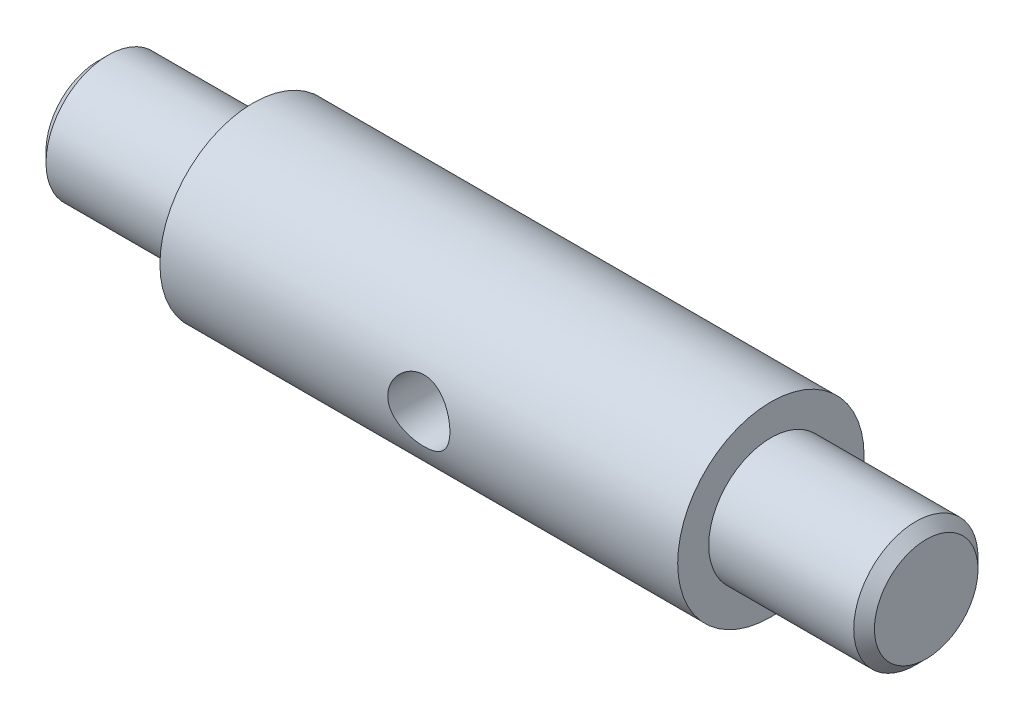
ISO-10303-21;
HEADER;
FILE_DESCRIPTION(('STEP AP214'),'2;1');
FILE_NAME('part.step','',(''),(''),'','','');
FILE_SCHEMA(('AUTOMOTIVE_DESIGN { 1 0 10303 214 1 1 1 1 }'));
ENDSEC;
DATA;
#1=APPLICATION_CONTEXT('core data for automotive mechanical design processes');
#2=APPLICATION_PROTOCOL_DEFINITION('international standard','automotive_design',2000,#1);
#3=PRODUCT_CONTEXT('',#1,'mechanical');
#4=PRODUCT('Part','Part','',(#3));
#5=PRODUCT_RELATED_PRODUCT_CATEGORY('part','',(#4));
#6=PRODUCT_DEFINITION_FORMATION('','',#4);
#7=PRODUCT_DEFINITION_CONTEXT('part definition',#1,'design');
#8=PRODUCT_DEFINITION('design','',#6,#7);
#9=PRODUCT_DEFINITION_SHAPE('','',#8);
#10=(LENGTH_UNIT() NAMED_UNIT(*) SI_UNIT(.MILLI.,.METRE.));
#11=(NAMED_UNIT(*) PLANE_ANGLE_UNIT() SI_UNIT($,.RADIAN.));
#12=(NAMED_UNIT(*) SI_UNIT($,.STERADIAN.) SOLID_ANGLE_UNIT());
#13=UNCERTAINTY_MEASURE_WITH_UNIT(LENGTH_MEASURE(1.E-05),#10,'distance_accuracy_value','');
#14=(GEOMETRIC_REPRESENTATION_CONTEXT(3) GLOBAL_UNCERTAINTY_ASSIGNED_CONTEXT((#13)) GLOBAL_UNIT_ASSIGNED_CONTEXT((#10,
#11,#12)) REPRESENTATION_CONTEXT('',''));
#15=CARTESIAN_POINT('',(0.,0.,0.));
#16=DIRECTION('',(0.,0.,1.));
#17=DIRECTION('',(1.,0.,0.));
#18=AXIS2_PLACEMENT_3D('',#15,#16,#17);
#19=CARTESIAN_POINT('',(8.00000000000001,0.,-9.));
#20=DIRECTION('',(0.,0.,1.));
#21=DIRECTION('',(1.,0.,0.));
#22=AXIS2_PLACEMENT_3D('',#19,#20,#21);
#23=CYLINDRICAL_SURFACE('',#22,3.);
#24=CARTESIAN_POINT('',(11.,0.,9.));
#25=CARTESIAN_POINT('',(11.0000007611949,-0.163690088660169,9.00000045902832));
#26=CARTESIAN_POINT('',(10.9865592016184,-0.327375583615649,8.99549308522634));
#27=CARTESIAN_POINT('',(10.9333126735484,-0.649925282618916,8.97795630609841));
#28=CARTESIAN_POINT('',(10.8935049681532,-0.808788984356453,8.96492601606457));
#29=CARTESIAN_POINT('',(10.7890422698479,-1.11699836850533,8.93175923719327));
#30=CARTESIAN_POINT('',(10.7244288126222,-1.2663594776581,8.91163463192559));
#31=CARTESIAN_POINT('',(10.572376481485,-1.55212481041597,8.86633337152025));
#32=CARTESIAN_POINT('',(10.4849331049922,-1.68852647087612,8.84115572003333));
#33=CARTESIAN_POINT('',(10.2865225854237,-1.9492250250668,8.78742283329015));
#34=CARTESIAN_POINT('',(10.1749062972185,-2.07301110089493,8.75878669391354));
#35=CARTESIAN_POINT('',(9.93269853588031,-2.30049807810625,8.70180944349364));
#36=CARTESIAN_POINT('',(9.80210289521447,-2.40419455646839,8.67346839871647));
#37=CARTESIAN_POINT('',(9.52104465441063,-2.59147482668358,8.61939997431821));
#38=CARTESIAN_POINT('',(9.37011878080364,-2.67439457466309,8.59377117827064));
#39=CARTESIAN_POINT('',(9.05547171662437,-2.81345662163316,8.54925916255803));
#40=CARTESIAN_POINT('',(8.89175444851177,-2.86960709216029,8.53037388482236));
#41=CARTESIAN_POINT('',(8.56198033550988,-2.95162038452749,8.50233909808131));
#42=CARTESIAN_POINT('',(8.39618837453281,-2.97844034481531,8.49288287308833));
#43=CARTESIAN_POINT('',(8.06220873753237,-3.00402337000343,8.48386969888522));
#44=CARTESIAN_POINT('',(7.89402181787244,-3.00279510481415,8.48430969068189));
#45=CARTESIAN_POINT('',(7.56819010866794,-2.97305971111026,8.4947704502454));
#46=CARTESIAN_POINT('',(7.41041479124295,-2.94580173950098,8.50435247602598));
#47=CARTESIAN_POINT('',(7.1018197411795,-2.86681848854825,8.53129973173652));
#48=CARTESIAN_POINT('',(6.9510008436948,-2.81509027977561,8.54866589352322));
#49=CARTESIAN_POINT('',(6.65776175122557,-2.68781717418063,8.58953733393746));
#50=CARTESIAN_POINT('',(6.51551592359143,-2.61190214612179,8.61313697379351));
#51=CARTESIAN_POINT('',(6.24538727516083,-2.43866731890942,8.66377675727179));
#52=CARTESIAN_POINT('',(6.11750861919986,-2.34134133709202,8.6908178937139));
#53=CARTESIAN_POINT('',(5.87272520551769,-2.12204799804671,8.74701987503222));
#54=CARTESIAN_POINT('',(5.7567419164728,-1.99905945022893,8.77621768064528));
#55=CARTESIAN_POINT('',(5.54680620000982,-1.73501870991019,8.83220815161109));
#56=CARTESIAN_POINT('',(5.45285588550652,-1.59396478698244,8.85900058614201));
#57=CARTESIAN_POINT('',(5.2889110992948,-1.2958428391388,8.9075132381338));
#58=CARTESIAN_POINT('',(5.21916352597781,-1.13862982924901,8.92918050024117));
#59=CARTESIAN_POINT('',(5.10739047813288,-0.813807250093522,8.96461701433304));
#60=CARTESIAN_POINT('',(5.0653553737297,-0.646201314464861,8.97838900964637));
#61=CARTESIAN_POINT('',(5.01183300193293,-0.313151488587912,8.99602881214321));
#62=CARTESIAN_POINT('',(4.99910057248175,-0.14792879959454,9.00030005501183));
#63=CARTESIAN_POINT('',(5.00099802079541,0.182325209880711,8.99966708084482));
#64=CARTESIAN_POINT('',(5.01562327993964,0.347356557958951,8.99476441258086));
#65=CARTESIAN_POINT('',(5.07083572320789,0.667559598912766,8.97660074151312));
#66=CARTESIAN_POINT('',(5.11065861814849,0.822878420504529,8.96358596133576));
#67=CARTESIAN_POINT('',(5.21418033340019,1.12456787573872,8.93075540490209));
#68=CARTESIAN_POINT('',(5.27788219840336,1.27093736552582,8.91093876140025));
#69=CARTESIAN_POINT('',(5.42921129552237,1.55486488917982,8.86586793861869));
#70=CARTESIAN_POINT('',(5.51742377984952,1.69208987765144,8.84048444267358));
#71=CARTESIAN_POINT('',(5.71458245004046,1.95019449040676,8.78715761748787));
#72=CARTESIAN_POINT('',(5.8235349680953,2.07106910338673,8.75921350781482));
#73=CARTESIAN_POINT('',(6.06493625301977,2.2987575234189,8.70230543941334));
#74=CARTESIAN_POINT('',(6.19822768078059,2.40468290773731,8.67335283262283));
#75=CARTESIAN_POINT('',(6.48131470343267,2.59277256697072,8.61899919884126));
#76=CARTESIAN_POINT('',(6.63111043590224,2.67493664379304,8.59359820146006));
#77=CARTESIAN_POINT('',(6.94301904586969,2.81279079124908,8.5494717537415));
#78=CARTESIAN_POINT('',(7.1051062375063,2.86853439649506,8.53073282378936));
#79=CARTESIAN_POINT('',(7.4371359501324,2.95168400027807,8.50232496919348));
#80=CARTESIAN_POINT('',(7.60707489621306,2.97910276486182,8.49265195870917));
#81=CARTESIAN_POINT('',(7.94059128812276,3.00382884743203,8.48393576622531));
#82=CARTESIAN_POINT('',(8.10404702086048,3.0026107719252,8.48437200772245));
#83=CARTESIAN_POINT('',(8.4282952247662,2.97372688034608,8.49453809471601));
#84=CARTESIAN_POINT('',(8.58908785386527,2.94606263837576,8.50426738708084));
#85=CARTESIAN_POINT('',(8.90040698900742,2.86611543938804,8.53153572914674));
#86=CARTESIAN_POINT('',(9.05107047501349,2.81431003804654,8.54892294067432));
#87=CARTESIAN_POINT('',(9.34168222081481,2.68793809727924,8.58949196455405));
#88=CARTESIAN_POINT('',(9.48162809356402,2.61336650566142,8.61267506290179));
#89=CARTESIAN_POINT('',(9.75345100976874,2.43978207775029,8.66348487678138));
#90=CARTESIAN_POINT('',(9.88470950569516,2.33984472829374,8.69126134926411));
#91=CARTESIAN_POINT('',(10.1290694401526,2.11992864940695,8.74750068849758));
#92=CARTESIAN_POINT('',(10.2421657270642,1.99994425335445,8.77596374737116));
#93=CARTESIAN_POINT('',(10.4514332368675,1.73772467076206,8.83170091576632));
#94=CARTESIAN_POINT('',(10.546773043253,1.59480454049919,8.85888545403769));
#95=CARTESIAN_POINT('',(10.7119712865519,1.29407207221987,8.90777973517836));
#96=CARTESIAN_POINT('',(10.7818362377661,1.13626355439705,8.92949087723789));
#97=CARTESIAN_POINT('',(10.891164897466,0.817480941602927,8.96416545205625));
#98=CARTESIAN_POINT('',(10.9318473987901,0.656963273029225,8.97747637267567));
#99=CARTESIAN_POINT('',(10.9862608420314,0.33096124803074,8.99539221192665));
#100=CARTESIAN_POINT('',(10.9999992304896,0.165478276706238,8.99999953595715));
#101=CARTESIAN_POINT('',(11.,0.,9.));
#102=B_SPLINE_CURVE_WITH_KNOTS('',3,(#24,#25,#26,#27,#28,#29,#30,#31,#32,#33,#34,#35,#36,#37,
#38,#39,#40,#41,#42,#43,#44,#45,#46,#47,#48,#49,#50,#51,#52,#53,#54,#55,#56,#57,#58,#59,#60,#61,
#62,#63,#64,#65,#66,#67,#68,#69,#70,#71,#72,#73,#74,#75,#76,#77,#78,#79,#80,#81,#82,#83,#84,#85,
#86,#87,#88,#89,#90,#91,#92,#93,#94,#95,#96,#97,#98,#99,#100,#101),.UNSPECIFIED.,.T.,.F.,(4,2,2,
2,2,2,2,2,2,2,2,2,2,2,2,2,2,2,2,2,2,2,2,2,2,2,2,2,2,2,2,2,2,2,2,2,2,2,4),(0.,0.490461318078032,
0.980973555802562,1.47066801861082,1.9604591333973,2.46554052848268,2.97073299862591,
3.49045154470411,4.010011340785,4.5120577722552,5.01394901962456,5.49290479653841,
5.97191792566446,6.45864513465392,6.94551307674621,7.45779917434101,7.97013437899854,
8.48755216951072,9.00479006631624,9.49960749525508,9.99434139492529,10.4747447393464,
10.9552093585231,11.4483119953121,11.9415654246567,12.4572306864226,12.9729002470499,
13.4875204148031,14.0019085411752,14.4898699819277,14.9778023805413,15.4564676124125,
15.9352391452793,16.4349020007541,16.9347063337134,17.453989825053,17.9731404345737,
18.4690967512144,18.9649159811442),.UNSPECIFIED.);
#103=CARTESIAN_POINT('',(11.,0.,9.));
#104=VERTEX_POINT('',#103);
#105=EDGE_CURVE('E87',#104,#104,#102,.T.);
#106=ORIENTED_EDGE('',*,*,#105,.F.);
#107=EDGE_LOOP('',(#106));
#108=FACE_BOUND('',#107,.T.);
#109=CARTESIAN_POINT('',(8.00000000000001,0.,0.));
#110=DIRECTION('',(0.707106781186547,0.,0.707106781186547));
#111=DIRECTION('',(-0.707106781186547,0.,0.707106781186547));
#112=AXIS2_PLACEMENT_3D('',#109,#110,#111);
#113=ELLIPSE('',#112,4.24264068711928,3.);
#114=CARTESIAN_POINT('',(8.00000000000001,-3.,0.));
#115=VERTEX_POINT('',#114);
#116=CARTESIAN_POINT('',(8.00000000000001,3.,0.));
#117=VERTEX_POINT('',#116);
#118=EDGE_CURVE('E50',#115,#117,#113,.F.);
#119=ORIENTED_EDGE('',*,*,#118,.T.);
#120=CARTESIAN_POINT('',(8.00000000000001,0.,0.));
#121=DIRECTION('',(-0.707106781186547,0.,0.707106781186547));
#122=DIRECTION('',(0.707106781186547,0.,0.707106781186547));
#123=AXIS2_PLACEMENT_3D('',#120,#121,#122);
#124=ELLIPSE('',#123,4.24264068711928,3.);
#125=EDGE_CURVE('E11',#117,#115,#124,.F.);
#126=ORIENTED_EDGE('',*,*,#125,.T.);
#127=EDGE_LOOP('',(#119,#126));
#128=FACE_BOUND('',#127,.T.);
#129=ADVANCED_FACE('F36',(#108,#128),#23,.F.);
#130=CARTESIAN_POINT('',(-32.,6.,0.));
#131=DIRECTION('',(1.,0.,0.));
#132=DIRECTION('',(0.,0.,-1.));
#133=AXIS2_PLACEMENT_3D('',#130,#131,#132);
#134=PLANE('',#133);
#135=CARTESIAN_POINT('',(-32.,0.,0.));
#136=DIRECTION('',(-1.,0.,0.));
#137=DIRECTION('',(0.,0.,1.));
#138=AXIS2_PLACEMENT_3D('',#135,#136,#137);
#139=CIRCLE('',#138,2.99999999999999);
#140=CARTESIAN_POINT('',(-32.,0.,2.99999999999999));
#141=VERTEX_POINT('',#140);
#142=EDGE_CURVE('E71',#141,#141,#139,.T.);
#143=ORIENTED_EDGE('',*,*,#142,.F.);
#144=EDGE_LOOP('',(#143));
#145=FACE_BOUND('',#144,.T.);
#146=CARTESIAN_POINT('',(-32.,0.,0.));
#147=DIRECTION('',(1.,0.,0.));
#148=DIRECTION('',(0.,0.,-1.));
#149=AXIS2_PLACEMENT_3D('',#146,#147,#148);
#150=CIRCLE('',#149,5.);
#151=CARTESIAN_POINT('',(-32.,0.,-5.));
#152=VERTEX_POINT('',#151);
#153=EDGE_CURVE('E171',#152,#152,#150,.F.);
#154=ORIENTED_EDGE('',*,*,#153,.T.);
#155=EDGE_LOOP('',(#154));
#156=FACE_BOUND('',#155,.T.);
#157=ADVANCED_FACE('F126',(#145,#156),#134,.F.);
#158=CARTESIAN_POINT('',(48.,0.,0.));
#159=DIRECTION('',(-1.,0.,0.));
#160=DIRECTION('',(0.,0.,1.));
#161=AXIS2_PLACEMENT_3D('',#158,#159,#160);
#162=PLANE('',#161);
#163=CARTESIAN_POINT('',(48.,0.,0.));
#164=DIRECTION('',(-1.,0.,0.));
#165=DIRECTION('',(0.,0.,1.));
#166=AXIS2_PLACEMENT_3D('',#163,#164,#165);
#167=CIRCLE('',#166,5.00000000000001);
#168=CARTESIAN_POINT('',(48.,0.,5.00000000000001));
#169=VERTEX_POINT('',#168);
#170=EDGE_CURVE('E168',#169,#169,#167,.F.);
#171=ORIENTED_EDGE('',*,*,#170,.T.);
#172=EDGE_LOOP('',(#171));
#173=FACE_BOUND('',#172,.T.);
#174=ADVANCED_FACE('F131',(#173),#162,.F.);
#175=CARTESIAN_POINT('',(-32.,0.,0.));
#176=DIRECTION('',(-1.,0.,0.));
#177=DIRECTION('',(0.,0.,1.));
#178=AXIS2_PLACEMENT_3D('',#175,#176,#177);
#179=CYLINDRICAL_SURFACE('',#178,6.);
#180=CARTESIAN_POINT('',(47.,0.,0.));
#181=DIRECTION('',(-1.,0.,0.));
#182=DIRECTION('',(0.,0.,1.));
#183=AXIS2_PLACEMENT_3D('',#180,#181,#182);
#184=CIRCLE('',#183,6.);
#185=CARTESIAN_POINT('',(47.,0.,6.));
#186=VERTEX_POINT('',#185);
#187=EDGE_CURVE('E170',#186,#186,#184,.T.);
#188=ORIENTED_EDGE('',*,*,#187,.T.);
#189=EDGE_LOOP('',(#188));
#190=FACE_BOUND('',#189,.T.);
#191=CARTESIAN_POINT('',(33.,0.,0.));
#192=DIRECTION('',(-1.,0.,0.));
#193=DIRECTION('',(0.,0.,1.));
#194=AXIS2_PLACEMENT_3D('',#191,#192,#193);
#195=CIRCLE('',#194,6.);
#196=CARTESIAN_POINT('',(33.,0.,6.));
#197=VERTEX_POINT('',#196);
#198=EDGE_CURVE('E84',#197,#197,#195,.T.);
#199=ORIENTED_EDGE('',*,*,#198,.F.);
#200=EDGE_LOOP('',(#199));
#201=FACE_BOUND('',#200,.T.);
#202=ADVANCED_FACE('F143',(#190,#201),#179,.T.);
#203=CARTESIAN_POINT('',(33.,6.,0.));
#204=DIRECTION('',(-1.,0.,0.));
#205=DIRECTION('',(0.,0.,1.));
#206=AXIS2_PLACEMENT_3D('',#203,#204,#205);
#207=PLANE('',#206);
#208=CARTESIAN_POINT('',(33.,0.,0.));
#209=DIRECTION('',(-1.,0.,0.));
#210=DIRECTION('',(0.,0.,1.));
#211=AXIS2_PLACEMENT_3D('',#208,#209,#210);
#212=CIRCLE('',#211,9.);
#213=CARTESIAN_POINT('',(33.,0.,9.));
#214=VERTEX_POINT('',#213);
#215=EDGE_CURVE('E81',#214,#214,#212,.T.);
#216=ORIENTED_EDGE('',*,*,#215,.F.);
#217=EDGE_LOOP('',(#216));
#218=FACE_BOUND('',#217,.T.);
#219=ORIENTED_EDGE('',*,*,#198,.T.);
#220=EDGE_LOOP('',(#219));
#221=FACE_BOUND('',#220,.T.);
#222=ADVANCED_FACE('F121',(#218,#221),#207,.F.);
#223=CARTESIAN_POINT('',(-32.,0.,0.));
#224=DIRECTION('',(-1.,0.,0.));
#225=DIRECTION('',(0.,0.,1.));
#226=AXIS2_PLACEMENT_3D('',#223,#224,#225);
#227=CYLINDRICAL_SURFACE('',#226,8.99999999999999);
#228=CARTESIAN_POINT('',(11.,0.,-8.99999999999999));
#229=CARTESIAN_POINT('',(11.0000007611949,0.16369008866017,-9.00000045902832));
#230=CARTESIAN_POINT('',(10.9865592016184,0.327375583615649,-8.99549308522634));
#231=CARTESIAN_POINT('',(10.9333126735484,0.649925282618916,-8.97795630609842));
#232=CARTESIAN_POINT('',(10.8935049681532,0.808788984356453,-8.96492601606457));
#233=CARTESIAN_POINT('',(10.7890422698479,1.11699836850533,-8.93175923719327));
#234=CARTESIAN_POINT('',(10.7244288126222,1.2663594776581,-8.91163463192559));
#235=CARTESIAN_POINT('',(10.572376481485,1.55212481041597,-8.86633337152025));
#236=CARTESIAN_POINT('',(10.4849331049922,1.68852647087612,-8.84115572003333));
#237=CARTESIAN_POINT('',(10.2865225854237,1.9492250250668,-8.78742283329015));
#238=CARTESIAN_POINT('',(10.1749062972185,2.07301110089493,-8.75878669391354));
#239=CARTESIAN_POINT('',(9.93269853588031,2.30049807810625,-8.70180944349364));
#240=CARTESIAN_POINT('',(9.80210289521447,2.40419455646839,-8.67346839871647));
#241=CARTESIAN_POINT('',(9.52104465441063,2.59147482668358,-8.61939997431821));
#242=CARTESIAN_POINT('',(9.37011878080364,2.67439457466309,-8.59377117827064));
#243=CARTESIAN_POINT('',(9.05547171662437,2.81345662163316,-8.54925916255803));
#244=CARTESIAN_POINT('',(8.89175444851177,2.86960709216029,-8.53037388482236));
#245=CARTESIAN_POINT('',(8.56198033550988,2.95162038452749,-8.50233909808131));
#246=CARTESIAN_POINT('',(8.39618837453281,2.97844034481531,-8.49288287308833));
#247=CARTESIAN_POINT('',(8.06220873753237,3.00402337000343,-8.48386969888522));
#248=CARTESIAN_POINT('',(7.89402181787244,3.00279510481415,-8.48430969068189));
#249=CARTESIAN_POINT('',(7.56819010866794,2.97305971111026,-8.4947704502454));
#250=CARTESIAN_POINT('',(7.41041479124295,2.94580173950098,-8.50435247602598));
#251=CARTESIAN_POINT('',(7.1018197411795,2.86681848854825,-8.53129973173652));
#252=CARTESIAN_POINT('',(6.9510008436948,2.81509027977561,-8.54866589352322));
#253=CARTESIAN_POINT('',(6.65776175122557,2.68781717418063,-8.58953733393746));
#254=CARTESIAN_POINT('',(6.51551592359143,2.61190214612179,-8.61313697379351));
#255=CARTESIAN_POINT('',(6.24538727516083,2.43866731890942,-8.66377675727179));
#256=CARTESIAN_POINT('',(6.11750861919986,2.34134133709202,-8.6908178937139));
#257=CARTESIAN_POINT('',(5.87272520551769,2.12204799804671,-8.74701987503222));
#258=CARTESIAN_POINT('',(5.7567419164728,1.99905945022893,-8.77621768064528));
#259=CARTESIAN_POINT('',(5.54680620000982,1.73501870991019,-8.83220815161109));
#260=CARTESIAN_POINT('',(5.45285588550652,1.59396478698244,-8.85900058614201));
#261=CARTESIAN_POINT('',(5.2889110992948,1.2958428391388,-8.9075132381338));
#262=CARTESIAN_POINT('',(5.21916352597781,1.13862982924901,-8.92918050024117));
#263=CARTESIAN_POINT('',(5.10739047813288,0.813807250093522,-8.96461701433304));
#264=CARTESIAN_POINT('',(5.0653553737297,0.646201314464861,-8.97838900964637));
#265=CARTESIAN_POINT('',(5.01183300193293,0.313151488587912,-8.99602881214321));
#266=CARTESIAN_POINT('',(4.99910057248175,0.14792879959454,-9.00030005501183));
#267=CARTESIAN_POINT('',(5.00099802079541,-0.182325209880711,-8.99966708084482));
#268=CARTESIAN_POINT('',(5.01562327993964,-0.347356557958951,-8.99476441258086));
#269=CARTESIAN_POINT('',(5.07083572320789,-0.667559598912766,-8.97660074151312));
#270=CARTESIAN_POINT('',(5.11065861814849,-0.822878420504529,-8.96358596133576));
#271=CARTESIAN_POINT('',(5.21418033340019,-1.12456787573872,-8.93075540490209));
#272=CARTESIAN_POINT('',(5.27788219840336,-1.27093736552582,-8.91093876140025));
#273=CARTESIAN_POINT('',(5.42921129552237,-1.55486488917982,-8.86586793861869));
#274=CARTESIAN_POINT('',(5.51742377984952,-1.69208987765144,-8.84048444267358));
#275=CARTESIAN_POINT('',(5.71458245004046,-1.95019449040676,-8.78715761748787));
#276=CARTESIAN_POINT('',(5.8235349680953,-2.07106910338673,-8.75921350781482));
#277=CARTESIAN_POINT('',(6.06493625301977,-2.2987575234189,-8.70230543941334));
#278=CARTESIAN_POINT('',(6.19822768078059,-2.40468290773731,-8.67335283262283));
#279=CARTESIAN_POINT('',(6.48131470343267,-2.59277256697072,-8.61899919884126));
#280=CARTESIAN_POINT('',(6.63111043590224,-2.67493664379304,-8.59359820146006));
#281=CARTESIAN_POINT('',(6.94301904586969,-2.81279079124908,-8.5494717537415));
#282=CARTESIAN_POINT('',(7.1051062375063,-2.86853439649506,-8.53073282378936));
#283=CARTESIAN_POINT('',(7.4371359501324,-2.95168400027807,-8.50232496919348));
#284=CARTESIAN_POINT('',(7.60707489621306,-2.97910276486182,-8.49265195870917));
#285=CARTESIAN_POINT('',(7.94059128812276,-3.00382884743203,-8.48393576622531));
#286=CARTESIAN_POINT('',(8.10404702086048,-3.0026107719252,-8.48437200772245));
#287=CARTESIAN_POINT('',(8.4282952247662,-2.97372688034608,-8.49453809471601));
#288=CARTESIAN_POINT('',(8.58908785386527,-2.94606263837576,-8.50426738708084));
#289=CARTESIAN_POINT('',(8.90040698900742,-2.86611543938804,-8.53153572914674));
#290=CARTESIAN_POINT('',(9.05107047501349,-2.81431003804654,-8.54892294067432));
#291=CARTESIAN_POINT('',(9.34168222081481,-2.68793809727924,-8.58949196455405));
#292=CARTESIAN_POINT('',(9.48162809356402,-2.61336650566142,-8.61267506290179));
#293=CARTESIAN_POINT('',(9.75345100976874,-2.43978207775029,-8.66348487678138));
#294=CARTESIAN_POINT('',(9.88470950569516,-2.33984472829374,-8.69126134926411));
#295=CARTESIAN_POINT('',(10.1290694401526,-2.11992864940695,-8.74750068849758));
#296=CARTESIAN_POINT('',(10.2421657270642,-1.99994425335445,-8.77596374737116));
#297=CARTESIAN_POINT('',(10.4514332368675,-1.73772467076206,-8.83170091576632));
#298=CARTESIAN_POINT('',(10.546773043253,-1.59480454049919,-8.85888545403769));
#299=CARTESIAN_POINT('',(10.7119712865519,-1.29407207221987,-8.90777973517836));
#300=CARTESIAN_POINT('',(10.7818362377661,-1.13626355439705,-8.92949087723789));
#301=CARTESIAN_POINT('',(10.891164897466,-0.817480941602927,-8.96416545205625));
#302=CARTESIAN_POINT('',(10.9318473987901,-0.656963273029225,-8.97747637267567));
#303=CARTESIAN_POINT('',(10.9862608420314,-0.33096124803074,-8.99539221192665));
#304=CARTESIAN_POINT('',(10.9999992304896,-0.165478276706239,-8.99999953595714));
#305=CARTESIAN_POINT('',(11.,0.,-8.99999999999999));
#306=B_SPLINE_CURVE_WITH_KNOTS('',3,(#228,#229,#230,#231,#232,#233,#234,#235,#236,#237,#238,
#239,#240,#241,#242,#243,#244,#245,#246,#247,#248,#249,#250,#251,#252,#253,#254,#255,#256,#257,
#258,#259,#260,#261,#262,#263,#264,#265,#266,#267,#268,#269,#270,#271,#272,#273,#274,#275,#276,
#277,#278,#279,#280,#281,#282,#283,#284,#285,#286,#287,#288,#289,#290,#291,#292,#293,#294,#295,
#296,#297,#298,#299,#300,#301,#302,#303,#304,#305),.UNSPECIFIED.,.T.,.F.,(4,2,2,2,2,2,2,2,2,2,2,
2,2,2,2,2,2,2,2,2,2,2,2,2,2,2,2,2,2,2,2,2,2,2,2,2,2,2,4),(0.,0.490461318078032,
0.980973555802561,1.47066801861082,1.9604591333973,2.46554052848268,2.97073299862591,
3.49045154470411,4.010011340785,4.5120577722552,5.01394901962456,5.49290479653841,
5.97191792566446,6.45864513465392,6.94551307674621,7.45779917434101,7.97013437899854,
8.48755216951072,9.00479006631624,9.49960749525508,9.99434139492529,10.4747447393464,
10.9552093585231,11.4483119953121,11.9415654246567,12.4572306864226,12.9729002470499,
13.4875204148031,14.0019085411752,14.4898699819277,14.9778023805413,15.4564676124125,
15.9352391452793,16.4349020007541,16.9347063337134,17.453989825053,17.9731404345737,
18.4690967512144,18.9649159811442),.UNSPECIFIED.);
#307=CARTESIAN_POINT('',(11.,0.,-8.99999999999999));
#308=VERTEX_POINT('',#307);
#309=EDGE_CURVE('E95',#308,#308,#306,.T.);
#310=ORIENTED_EDGE('',*,*,#309,.T.);
#311=EDGE_LOOP('',(#310));
#312=FACE_BOUND('',#311,.T.);
#313=ORIENTED_EDGE('',*,*,#105,.T.);
#314=EDGE_LOOP('',(#313));
#315=FACE_BOUND('',#314,.T.);
#316=CARTESIAN_POINT('',(-17.,0.,0.));
#317=DIRECTION('',(-1.,0.,0.));
#318=DIRECTION('',(0.,0.,1.));
#319=AXIS2_PLACEMENT_3D('',#316,#317,#318);
#320=CIRCLE('',#319,8.99999999999999);
#321=CARTESIAN_POINT('',(-17.,0.,8.99999999999999));
#322=VERTEX_POINT('',#321);
#323=EDGE_CURVE('E74',#322,#322,#320,.T.);
#324=ORIENTED_EDGE('',*,*,#323,.F.);
#325=EDGE_LOOP('',(#324));
#326=FACE_BOUND('',#325,.T.);
#327=ORIENTED_EDGE('',*,*,#215,.T.);
#328=EDGE_LOOP('',(#327));
#329=FACE_BOUND('',#328,.T.);
#330=ADVANCED_FACE('F100',(#312,#315,#326,#329),#227,.T.);
#331=CARTESIAN_POINT('',(-17.,8.99999999999999,0.));
#332=DIRECTION('',(1.,0.,0.));
#333=DIRECTION('',(0.,0.,-1.));
#334=AXIS2_PLACEMENT_3D('',#331,#332,#333);
#335=PLANE('',#334);
#336=CARTESIAN_POINT('',(-17.,0.,0.));
#337=DIRECTION('',(-1.,0.,0.));
#338=DIRECTION('',(0.,0.,1.));
#339=AXIS2_PLACEMENT_3D('',#336,#337,#338);
#340=CIRCLE('',#339,6.);
#341=CARTESIAN_POINT('',(-17.,0.,6.));
#342=VERTEX_POINT('',#341);
#343=EDGE_CURVE('E70',#342,#342,#340,.T.);
#344=ORIENTED_EDGE('',*,*,#343,.F.);
#345=EDGE_LOOP('',(#344));
#346=FACE_BOUND('',#345,.T.);
#347=ORIENTED_EDGE('',*,*,#323,.T.);
#348=EDGE_LOOP('',(#347));
#349=FACE_BOUND('',#348,.T.);
#350=ADVANCED_FACE('F114',(#346,#349),#335,.F.);
#351=CARTESIAN_POINT('',(-32.,0.,0.));
#352=DIRECTION('',(-1.,0.,0.));
#353=DIRECTION('',(0.,0.,1.));
#354=AXIS2_PLACEMENT_3D('',#351,#352,#353);
#355=CYLINDRICAL_SURFACE('',#354,6.);
#356=CARTESIAN_POINT('',(-31.,0.,0.));
#357=DIRECTION('',(1.,0.,0.));
#358=DIRECTION('',(0.,0.,-1.));
#359=AXIS2_PLACEMENT_3D('',#356,#357,#358);
#360=CIRCLE('',#359,6.);
#361=CARTESIAN_POINT('',(-31.,0.,-6.));
#362=VERTEX_POINT('',#361);
#363=EDGE_CURVE('E177',#362,#362,#360,.T.);
#364=ORIENTED_EDGE('',*,*,#363,.T.);
#365=EDGE_LOOP('',(#364));
#366=FACE_BOUND('',#365,.T.);
#367=ORIENTED_EDGE('',*,*,#343,.T.);
#368=EDGE_LOOP('',(#367));
#369=FACE_BOUND('',#368,.T.);
#370=ADVANCED_FACE('F109',(#366,#369),#355,.T.);
#371=CARTESIAN_POINT('',(8.00000000000001,0.,0.));
#372=DIRECTION('',(0.707106781186547,0.,0.707106781186547));
#373=DIRECTION('',(-0.707106781186547,0.,0.707106781186547));
#374=AXIS2_PLACEMENT_3D('',#371,#372,#373);
#375=ELLIPSE('',#374,4.24264068711928,3.);
#376=EDGE_CURVE('E57',#115,#117,#375,.T.);
#377=ORIENTED_EDGE('',*,*,#376,.T.);
#378=CARTESIAN_POINT('',(8.00000000000001,0.,0.));
#379=DIRECTION('',(-0.707106781186547,0.,0.707106781186547));
#380=DIRECTION('',(0.707106781186547,0.,0.707106781186547));
#381=AXIS2_PLACEMENT_3D('',#378,#379,#380);
#382=ELLIPSE('',#381,4.24264068711928,3.);
#383=EDGE_CURVE('E45',#117,#115,#382,.T.);
#384=ORIENTED_EDGE('',*,*,#383,.T.);
#385=EDGE_LOOP('',(#377,#384));
#386=FACE_BOUND('',#385,.T.);
#387=ORIENTED_EDGE('',*,*,#309,.F.);
#388=EDGE_LOOP('',(#387));
#389=FACE_BOUND('',#388,.T.);
#390=ADVANCED_FACE('F104',(#386,#389),#23,.F.);
#391=CARTESIAN_POINT('',(47.,0.,0.));
#392=DIRECTION('',(-1.,0.,0.));
#393=DIRECTION('',(0.,0.,1.));
#394=AXIS2_PLACEMENT_3D('',#391,#392,#393);
#395=CONICAL_SURFACE('',#394,6.,0.78539816339746);
#396=ORIENTED_EDGE('',*,*,#170,.F.);
#397=EDGE_LOOP('',(#396));
#398=FACE_BOUND('',#397,.T.);
#399=ORIENTED_EDGE('',*,*,#187,.F.);
#400=EDGE_LOOP('',(#399));
#401=FACE_BOUND('',#400,.T.);
#402=ADVANCED_FACE('F108',(#398,#401),#395,.T.);
#403=CARTESIAN_POINT('',(-32.,0.,0.));
#404=DIRECTION('',(1.,0.,0.));
#405=DIRECTION('',(0.,0.,-1.));
#406=AXIS2_PLACEMENT_3D('',#403,#404,#405);
#407=CONICAL_SURFACE('',#406,5.,0.785398163397445);
#408=ORIENTED_EDGE('',*,*,#363,.F.);
#409=EDGE_LOOP('',(#408));
#410=FACE_BOUND('',#409,.T.);
#411=ORIENTED_EDGE('',*,*,#153,.F.);
#412=EDGE_LOOP('',(#411));
#413=FACE_BOUND('',#412,.T.);
#414=ADVANCED_FACE('F39',(#410,#413),#407,.T.);
#415=CARTESIAN_POINT('',(-32.,0.,0.));
#416=DIRECTION('',(-1.,0.,0.));
#417=DIRECTION('',(0.,0.,1.));
#418=AXIS2_PLACEMENT_3D('',#415,#416,#417);
#419=CYLINDRICAL_SURFACE('',#418,2.99999999999999);
#420=ORIENTED_EDGE('',*,*,#142,.T.);
#421=EDGE_LOOP('',(#420));
#422=FACE_BOUND('',#421,.T.);
#423=ORIENTED_EDGE('',*,*,#118,.F.);
#424=ORIENTED_EDGE('',*,*,#383,.F.);
#425=EDGE_LOOP('',(#423,#424));
#426=FACE_BOUND('',#425,.T.);
#427=ADVANCED_FACE('F163',(#422,#426),#419,.F.);
#428=CARTESIAN_POINT('',(13.,0.,0.));
#429=DIRECTION('',(-1.,0.,0.));
#430=DIRECTION('',(0.,0.,1.));
#431=AXIS2_PLACEMENT_3D('',#428,#429,#430);
#432=CIRCLE('',#431,2.99999999999999);
#433=CARTESIAN_POINT('',(13.,0.,2.99999999999999));
#434=VERTEX_POINT('',#433);
#435=EDGE_CURVE('E68',#434,#434,#432,.T.);
#436=ORIENTED_EDGE('',*,*,#435,.F.);
#437=EDGE_LOOP('',(#436));
#438=FACE_BOUND('',#437,.T.);
#439=ORIENTED_EDGE('',*,*,#376,.F.);
#440=ORIENTED_EDGE('',*,*,#125,.F.);
#441=EDGE_LOOP('',(#439,#440));
#442=FACE_BOUND('',#441,.T.);
#443=ADVANCED_FACE('F64',(#438,#442),#419,.F.);
#444=CARTESIAN_POINT('',(13.,0.,0.));
#445=DIRECTION('',(-1.,0.,0.));
#446=DIRECTION('',(0.,0.,1.));
#447=AXIS2_PLACEMENT_3D('',#444,#445,#446);
#448=CONICAL_SURFACE('',#447,2.99999999999999,1.02974425867665);
#449=CARTESIAN_POINT('',(14.8025818570827,0.,0.));
#450=VERTEX_POINT('',#449);
#451=VERTEX_LOOP('',#450);
#452=FACE_BOUND('',#451,.T.);
#453=ORIENTED_EDGE('',*,*,#435,.T.);
#454=EDGE_LOOP('',(#453));
#455=FACE_BOUND('',#454,.T.);
#456=ADVANCED_FACE('F61',(#452,#455),#448,.F.);
#457=CLOSED_SHELL('',(#129,#157,#174,#202,#222,#330,#350,#370,#390,#402,#414,#427,#443,#456));
#458=MANIFOLD_SOLID_BREP('B2',#457);
#459=ADVANCED_BREP_SHAPE_REPRESENTATION('',(#18,#458),#14);
#460=SHAPE_DEFINITION_REPRESENTATION(#9,#459);
ENDSEC;
END-ISO-10303-21;
